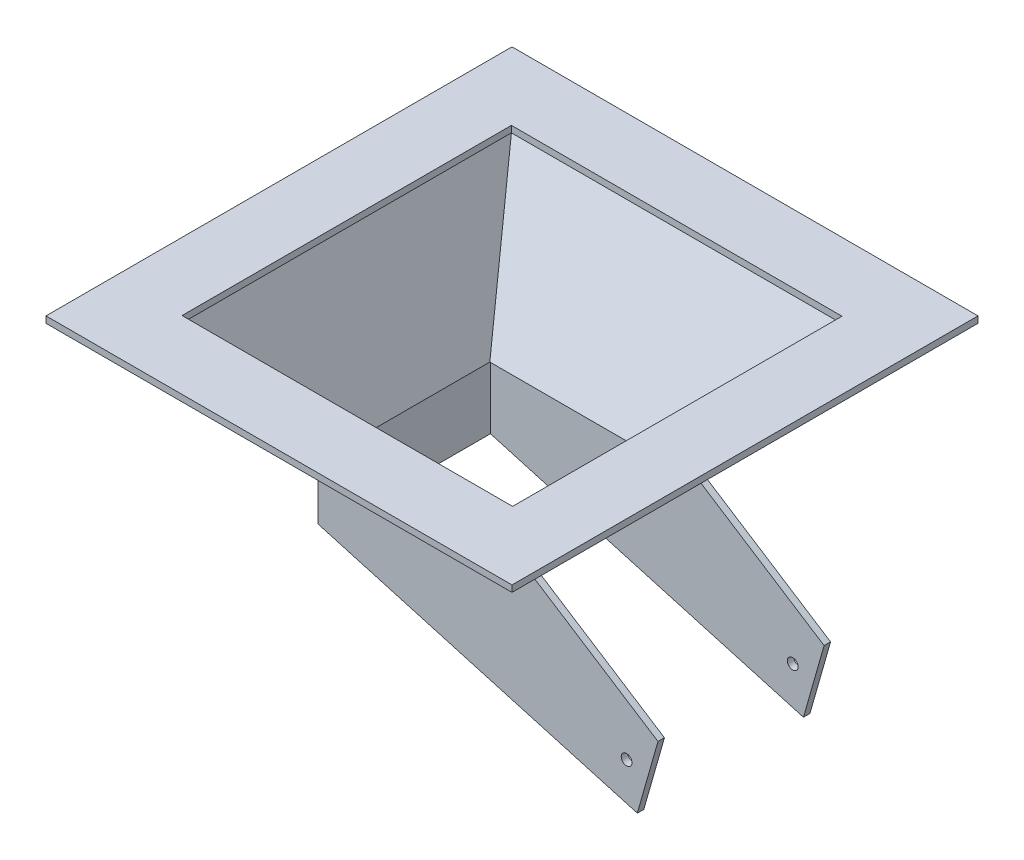
ISO-10303-21;
HEADER;
FILE_DESCRIPTION(('STEP AP214'),'2;1');
FILE_NAME('part.step','',(''),(''),'','','');
FILE_SCHEMA(('AUTOMOTIVE_DESIGN { 1 0 10303 214 1 1 1 1 }'));
ENDSEC;
DATA;
#1=APPLICATION_CONTEXT('core data for automotive mechanical design processes');
#2=APPLICATION_PROTOCOL_DEFINITION('international standard','automotive_design',2000,#1);
#3=PRODUCT_CONTEXT('',#1,'mechanical');
#4=PRODUCT('Part','Part','',(#3));
#5=PRODUCT_RELATED_PRODUCT_CATEGORY('part','',(#4));
#6=PRODUCT_DEFINITION_FORMATION('','',#4);
#7=PRODUCT_DEFINITION_CONTEXT('part definition',#1,'design');
#8=PRODUCT_DEFINITION('design','',#6,#7);
#9=PRODUCT_DEFINITION_SHAPE('','',#8);
#10=(LENGTH_UNIT() NAMED_UNIT(*) SI_UNIT(.MILLI.,.METRE.));
#11=(NAMED_UNIT(*) PLANE_ANGLE_UNIT() SI_UNIT($,.RADIAN.));
#12=(NAMED_UNIT(*) SI_UNIT($,.STERADIAN.) SOLID_ANGLE_UNIT());
#13=UNCERTAINTY_MEASURE_WITH_UNIT(LENGTH_MEASURE(1.E-05),#10,'distance_accuracy_value','');
#14=(GEOMETRIC_REPRESENTATION_CONTEXT(3) GLOBAL_UNCERTAINTY_ASSIGNED_CONTEXT((#13)) GLOBAL_UNIT_ASSIGNED_CONTEXT((#10,
#11,#12)) REPRESENTATION_CONTEXT('',''));
#15=CARTESIAN_POINT('',(0.,0.,0.));
#16=DIRECTION('',(0.,0.,1.));
#17=DIRECTION('',(1.,0.,0.));
#18=AXIS2_PLACEMENT_3D('',#15,#16,#17);
#19=CARTESIAN_POINT('',(0.,0.,0.));
#20=DIRECTION('',(0.,-1.,0.));
#21=DIRECTION('',(0.,0.,-1.));
#22=AXIS2_PLACEMENT_3D('',#19,#20,#21);
#23=PLANE('',#22);
#24=DIRECTION('',(1.,0.,0.));
#25=VECTOR('',#24,1.);
#26=CARTESIAN_POINT('',(0.,0.,36.335012556094));
#27=LINE('',#26,#25);
#28=CARTESIAN_POINT('',(-46.6098562283815,0.,36.335012556094));
#29=VERTEX_POINT('',#28);
#30=CARTESIAN_POINT('',(46.6098562283815,0.,36.335012556094));
#31=VERTEX_POINT('',#30);
#32=EDGE_CURVE('E569',#29,#31,#27,.T.);
#33=ORIENTED_EDGE('',*,*,#32,.T.);
#34=DIRECTION('',(0.,0.,-1.));
#35=VECTOR('',#34,1.);
#36=CARTESIAN_POINT('',(46.6098562283815,0.,0.));
#37=LINE('',#36,#35);
#38=CARTESIAN_POINT('',(46.6098562283815,0.,-36.335012556094));
#39=VERTEX_POINT('',#38);
#40=EDGE_CURVE('E572',#31,#39,#37,.T.);
#41=ORIENTED_EDGE('',*,*,#40,.T.);
#42=DIRECTION('',(-1.,0.,0.));
#43=VECTOR('',#42,1.);
#44=CARTESIAN_POINT('',(0.,0.,-36.335012556094));
#45=LINE('',#44,#43);
#46=CARTESIAN_POINT('',(-46.6098562283815,0.,-36.335012556094));
#47=VERTEX_POINT('',#46);
#48=EDGE_CURVE('E579',#39,#47,#45,.T.);
#49=ORIENTED_EDGE('',*,*,#48,.T.);
#50=DIRECTION('',(0.,0.,1.));
#51=VECTOR('',#50,1.);
#52=CARTESIAN_POINT('',(-46.6098562283815,0.,0.));
#53=LINE('',#52,#51);
#54=EDGE_CURVE('E574',#47,#29,#53,.T.);
#55=ORIENTED_EDGE('',*,*,#54,.T.);
#56=EDGE_LOOP('',(#33,#41,#49,#55));
#57=FACE_BOUND('',#56,.T.);
#58=DIRECTION('',(-1.,0.,0.));
#59=VECTOR('',#58,1.);
#60=CARTESIAN_POINT('',(-50.,0.,37.));
#61=LINE('',#60,#59);
#62=CARTESIAN_POINT('',(50.,0.,37.));
#63=VERTEX_POINT('',#62);
#64=CARTESIAN_POINT('',(-47.,0.,37.));
#65=VERTEX_POINT('',#64);
#66=EDGE_CURVE('E222',#63,#65,#61,.T.);
#67=ORIENTED_EDGE('',*,*,#66,.T.);
#68=DIRECTION('',(0.,0.,-1.));
#69=VECTOR('',#68,1.);
#70=CARTESIAN_POINT('',(-47.,0.,40.));
#71=LINE('',#70,#69);
#72=CARTESIAN_POINT('',(-47.,0.,-37.));
#73=VERTEX_POINT('',#72);
#74=EDGE_CURVE('E221',#65,#73,#71,.T.);
#75=ORIENTED_EDGE('',*,*,#74,.T.);
#76=DIRECTION('',(-1.,0.,0.));
#77=VECTOR('',#76,1.);
#78=CARTESIAN_POINT('',(-50.,0.,-37.));
#79=LINE('',#78,#77);
#80=CARTESIAN_POINT('',(50.,0.,-37.));
#81=VERTEX_POINT('',#80);
#82=EDGE_CURVE('E208',#81,#73,#79,.T.);
#83=ORIENTED_EDGE('',*,*,#82,.F.);
#84=DIRECTION('',(0.,0.,-1.));
#85=VECTOR('',#84,1.);
#86=CARTESIAN_POINT('',(50.,0.,40.));
#87=LINE('',#86,#85);
#88=EDGE_CURVE('E439',#63,#81,#87,.T.);
#89=ORIENTED_EDGE('',*,*,#88,.F.);
#90=EDGE_LOOP('',(#67,#75,#83,#89));
#91=FACE_BOUND('',#90,.T.);
#92=ADVANCED_FACE('F49',(#57,#91),#23,.T.);
#93=CARTESIAN_POINT('',(0.,0.,37.));
#94=DIRECTION('',(0.,0.,-1.));
#95=DIRECTION('',(-1.,0.,0.));
#96=AXIS2_PLACEMENT_3D('',#93,#94,#95);
#97=PLANE('',#96);
#98=CARTESIAN_POINT('',(93.1244971886201,-51.5905321351691,37.));
#99=DIRECTION('',(0.,0.,-1.));
#100=DIRECTION('',(-1.,0.,0.));
#101=AXIS2_PLACEMENT_3D('',#98,#99,#100);
#102=CIRCLE('',#101,2.5);
#103=CARTESIAN_POINT('',(90.6244971886201,-51.5905321351691,37.));
#104=VERTEX_POINT('',#103);
#105=EDGE_CURVE('E225',#104,#104,#102,.T.);
#106=ORIENTED_EDGE('',*,*,#105,.F.);
#107=EDGE_LOOP('',(#106));
#108=FACE_BOUND('',#107,.T.);
#109=DIRECTION('',(0.961884621768214,-0.273455616884751,0.));
#110=VECTOR('',#109,1.);
#111=CARTESIAN_POINT('',(98.094598,-70.577127,37.));
#112=LINE('',#111,#110);
#113=CARTESIAN_POINT('',(-47.,-29.327966856658,37.));
#114=VERTEX_POINT('',#113);
#115=CARTESIAN_POINT('',(98.094598,-70.577127,37.));
#116=VERTEX_POINT('',#115);
#117=EDGE_CURVE('E69',#114,#116,#112,.T.);
#118=ORIENTED_EDGE('',*,*,#117,.F.);
#119=DIRECTION('',(0.,1.,0.));
#120=VECTOR('',#119,1.);
#121=CARTESIAN_POINT('',(-47.,0.,37.));
#122=LINE('',#121,#120);
#123=EDGE_CURVE('E73',#114,#65,#122,.T.);
#124=ORIENTED_EDGE('',*,*,#123,.T.);
#125=ORIENTED_EDGE('',*,*,#66,.F.);
#126=DIRECTION('',(-0.841573516080053,0.540142589537853,0.));
#127=VECTOR('',#126,1.);
#128=CARTESIAN_POINT('',(50.,0.,37.));
#129=LINE('',#128,#127);
#130=CARTESIAN_POINT('',(107.665544,-37.011165,37.));
#131=VERTEX_POINT('',#130);
#132=EDGE_CURVE('E260',#131,#63,#129,.T.);
#133=ORIENTED_EDGE('',*,*,#132,.F.);
#134=DIRECTION('',(0.274209108479293,0.961670091469518,0.));
#135=VECTOR('',#134,1.);
#136=CARTESIAN_POINT('',(107.665544,-37.011165,37.));
#137=LINE('',#136,#135);
#138=EDGE_CURVE('E258',#116,#131,#137,.T.);
#139=ORIENTED_EDGE('',*,*,#138,.F.);
#140=EDGE_LOOP('',(#118,#124,#125,#133,#139));
#141=FACE_BOUND('',#140,.T.);
#142=ADVANCED_FACE('F303',(#108,#141),#97,.T.);
#143=CARTESIAN_POINT('',(0.,0.,-37.));
#144=DIRECTION('',(0.,0.,-1.));
#145=DIRECTION('',(-1.,0.,0.));
#146=AXIS2_PLACEMENT_3D('',#143,#144,#145);
#147=PLANE('',#146);
#148=CARTESIAN_POINT('',(93.1244971886201,-51.5905321351691,-37.));
#149=DIRECTION('',(0.,0.,-1.));
#150=DIRECTION('',(-1.,0.,0.));
#151=AXIS2_PLACEMENT_3D('',#148,#149,#150);
#152=CIRCLE('',#151,2.5);
#153=CARTESIAN_POINT('',(90.6244971886201,-51.5905321351691,-37.));
#154=VERTEX_POINT('',#153);
#155=EDGE_CURVE('E975',#154,#154,#152,.T.);
#156=ORIENTED_EDGE('',*,*,#155,.T.);
#157=EDGE_LOOP('',(#156));
#158=FACE_BOUND('',#157,.T.);
#159=DIRECTION('',(0.,1.,0.));
#160=VECTOR('',#159,1.);
#161=CARTESIAN_POINT('',(-47.,0.,-37.));
#162=LINE('',#161,#160);
#163=CARTESIAN_POINT('',(-47.,-29.327966856658,-37.));
#164=VERTEX_POINT('',#163);
#165=EDGE_CURVE('E12',#164,#73,#162,.T.);
#166=ORIENTED_EDGE('',*,*,#165,.F.);
#167=DIRECTION('',(0.961884621768214,-0.273455616884751,0.));
#168=VECTOR('',#167,1.);
#169=CARTESIAN_POINT('',(98.094598,-70.577127,-37.));
#170=LINE('',#169,#168);
#171=CARTESIAN_POINT('',(98.094598,-70.577127,-37.));
#172=VERTEX_POINT('',#171);
#173=EDGE_CURVE('E232',#164,#172,#170,.T.);
#174=ORIENTED_EDGE('',*,*,#173,.T.);
#175=DIRECTION('',(0.274209108479293,0.961670091469518,0.));
#176=VECTOR('',#175,1.);
#177=CARTESIAN_POINT('',(107.665544,-37.011165,-37.));
#178=LINE('',#177,#176);
#179=CARTESIAN_POINT('',(107.665544,-37.011165,-37.));
#180=VERTEX_POINT('',#179);
#181=EDGE_CURVE('E243',#172,#180,#178,.T.);
#182=ORIENTED_EDGE('',*,*,#181,.T.);
#183=DIRECTION('',(-0.841573516080053,0.540142589537853,0.));
#184=VECTOR('',#183,1.);
#185=CARTESIAN_POINT('',(50.,0.,-37.));
#186=LINE('',#185,#184);
#187=EDGE_CURVE('E214',#180,#81,#186,.T.);
#188=ORIENTED_EDGE('',*,*,#187,.T.);
#189=ORIENTED_EDGE('',*,*,#82,.T.);
#190=EDGE_LOOP('',(#166,#174,#182,#188,#189));
#191=FACE_BOUND('',#190,.T.);
#192=ADVANCED_FACE('F210',(#158,#191),#147,.F.);
#193=CARTESIAN_POINT('',(-39.1540130151844,-20.6073752711497,0.));
#194=DIRECTION('',(-0.884918222381982,-0.465746432832622,0.));
#195=DIRECTION('',(0.465746432832622,-0.884918222381982,0.));
#196=AXIS2_PLACEMENT_3D('',#193,#194,#195);
#197=PLANE('',#196);
#198=DIRECTION('',(-0.395662690984882,0.751759112871275,0.527550254646509));
#199=VECTOR('',#198,1.);
#200=CARTESIAN_POINT('',(-50.,0.,40.));
#201=LINE('',#200,#199);
#202=CARTESIAN_POINT('',(-50.,0.,40.));
#203=VERTEX_POINT('',#202);
#204=CARTESIAN_POINT('',(-80.,57.,80.));
#205=VERTEX_POINT('',#204);
#206=EDGE_CURVE('E370',#203,#205,#201,.T.);
#207=ORIENTED_EDGE('',*,*,#206,.T.);
#208=DIRECTION('',(0.,0.,1.));
#209=VECTOR('',#208,1.);
#210=CARTESIAN_POINT('',(-80.,57.,80.));
#211=LINE('',#210,#209);
#212=CARTESIAN_POINT('',(-80.,57.,-80.));
#213=VERTEX_POINT('',#212);
#214=EDGE_CURVE('E365',#213,#205,#211,.T.);
#215=ORIENTED_EDGE('',*,*,#214,.F.);
#216=DIRECTION('',(-0.395662690984882,0.751759112871275,-0.527550254646509));
#217=VECTOR('',#216,1.);
#218=CARTESIAN_POINT('',(-50.,0.,-40.));
#219=LINE('',#218,#217);
#220=CARTESIAN_POINT('',(-50.,0.,-40.));
#221=VERTEX_POINT('',#220);
#222=EDGE_CURVE('E362',#221,#213,#219,.T.);
#223=ORIENTED_EDGE('',*,*,#222,.F.);
#224=DIRECTION('',(0.,0.,1.));
#225=VECTOR('',#224,1.);
#226=CARTESIAN_POINT('',(-50.,0.,40.));
#227=LINE('',#226,#225);
#228=CARTESIAN_POINT('',(-50.,0.,-37.));
#229=VERTEX_POINT('',#228);
#230=EDGE_CURVE('E343',#221,#229,#227,.T.);
#231=ORIENTED_EDGE('',*,*,#230,.T.);
#232=CARTESIAN_POINT('',(-50.,0.,37.));
#233=VERTEX_POINT('',#232);
#234=EDGE_CURVE('E347',#229,#233,#227,.T.);
#235=ORIENTED_EDGE('',*,*,#234,.T.);
#236=DIRECTION('',(0.,0.,-1.));
#237=VECTOR('',#236,1.);
#238=CARTESIAN_POINT('',(-50.,0.,40.));
#239=LINE('',#238,#237);
#240=EDGE_CURVE('E275',#203,#233,#239,.T.);
#241=ORIENTED_EDGE('',*,*,#240,.F.);
#242=EDGE_LOOP('',(#207,#215,#223,#231,#235,#241));
#243=FACE_BOUND('',#242,.T.);
#244=ADVANCED_FACE('F363',(#243),#197,.T.);
#245=CARTESIAN_POINT('',(0.,-18.8080016498247,-26.8014023510002));
#246=DIRECTION('',(0.,0.57442574909643,0.818556692462413));
#247=DIRECTION('',(0.,-0.818556692462413,0.57442574909643));
#248=AXIS2_PLACEMENT_3D('',#245,#246,#247);
#249=PLANE('',#248);
#250=ORIENTED_EDGE('',*,*,#222,.T.);
#251=DIRECTION('',(-1.,0.,0.));
#252=VECTOR('',#251,1.);
#253=CARTESIAN_POINT('',(-80.,57.,-80.));
#254=LINE('',#253,#252);
#255=CARTESIAN_POINT('',(80.,57.,-80.));
#256=VERTEX_POINT('',#255);
#257=EDGE_CURVE('E459',#256,#213,#254,.T.);
#258=ORIENTED_EDGE('',*,*,#257,.F.);
#259=DIRECTION('',(0.395662690984881,0.751759112871275,-0.527550254646509));
#260=VECTOR('',#259,1.);
#261=CARTESIAN_POINT('',(50.,0.,-40.));
#262=LINE('',#261,#260);
#263=CARTESIAN_POINT('',(50.,0.,-40.));
#264=VERTEX_POINT('',#263);
#265=EDGE_CURVE('E373',#264,#256,#262,.T.);
#266=ORIENTED_EDGE('',*,*,#265,.F.);
#267=DIRECTION('',(-1.,0.,0.));
#268=VECTOR('',#267,1.);
#269=CARTESIAN_POINT('',(-50.,0.,-40.));
#270=LINE('',#269,#268);
#271=EDGE_CURVE('E356',#264,#221,#270,.T.);
#272=ORIENTED_EDGE('',*,*,#271,.T.);
#273=EDGE_LOOP('',(#250,#258,#266,#272));
#274=FACE_BOUND('',#273,.T.);
#275=ADVANCED_FACE('F400',(#274),#249,.F.);
#276=CARTESIAN_POINT('',(0.,-18.8080016498247,26.8014023510002));
#277=DIRECTION('',(0.,0.57442574909643,-0.818556692462413));
#278=DIRECTION('',(0.,0.818556692462413,0.57442574909643));
#279=AXIS2_PLACEMENT_3D('',#276,#277,#278);
#280=PLANE('',#279);
#281=DIRECTION('',(0.395662690984881,0.751759112871275,0.527550254646509));
#282=VECTOR('',#281,1.);
#283=CARTESIAN_POINT('',(50.,0.,40.));
#284=LINE('',#283,#282);
#285=CARTESIAN_POINT('',(50.,0.,40.));
#286=VERTEX_POINT('',#285);
#287=CARTESIAN_POINT('',(80.,57.,80.));
#288=VERTEX_POINT('',#287);
#289=EDGE_CURVE('E369',#286,#288,#284,.T.);
#290=ORIENTED_EDGE('',*,*,#289,.T.);
#291=DIRECTION('',(1.,0.,0.));
#292=VECTOR('',#291,1.);
#293=CARTESIAN_POINT('',(-80.,57.,80.));
#294=LINE('',#293,#292);
#295=EDGE_CURVE('E61',#205,#288,#294,.T.);
#296=ORIENTED_EDGE('',*,*,#295,.F.);
#297=ORIENTED_EDGE('',*,*,#206,.F.);
#298=DIRECTION('',(1.,0.,0.));
#299=VECTOR('',#298,1.);
#300=CARTESIAN_POINT('',(-50.,0.,40.));
#301=LINE('',#300,#299);
#302=EDGE_CURVE('E281',#203,#286,#301,.T.);
#303=ORIENTED_EDGE('',*,*,#302,.T.);
#304=EDGE_LOOP('',(#290,#296,#297,#303));
#305=FACE_BOUND('',#304,.T.);
#306=ADVANCED_FACE('F447',(#305),#280,.F.);
#307=CARTESIAN_POINT('',(39.1540130151844,-20.6073752711497,0.));
#308=DIRECTION('',(0.884918222381983,-0.465746432832622,0.));
#309=DIRECTION('',(0.465746432832622,0.884918222381983,0.));
#310=AXIS2_PLACEMENT_3D('',#307,#308,#309);
#311=PLANE('',#310);
#312=ORIENTED_EDGE('',*,*,#265,.T.);
#313=DIRECTION('',(0.,0.,-1.));
#314=VECTOR('',#313,1.);
#315=CARTESIAN_POINT('',(80.,57.,80.));
#316=LINE('',#315,#314);
#317=EDGE_CURVE('E454',#288,#256,#316,.T.);
#318=ORIENTED_EDGE('',*,*,#317,.F.);
#319=ORIENTED_EDGE('',*,*,#289,.F.);
#320=EDGE_CURVE('E948',#286,#63,#87,.T.);
#321=ORIENTED_EDGE('',*,*,#320,.T.);
#322=ORIENTED_EDGE('',*,*,#88,.T.);
#323=DIRECTION('',(0.,0.,1.));
#324=VECTOR('',#323,1.);
#325=CARTESIAN_POINT('',(50.,0.,-40.));
#326=LINE('',#325,#324);
#327=EDGE_CURVE('E247',#264,#81,#326,.T.);
#328=ORIENTED_EDGE('',*,*,#327,.F.);
#329=EDGE_LOOP('',(#312,#318,#319,#321,#322,#328));
#330=FACE_BOUND('',#329,.T.);
#331=ADVANCED_FACE('F51',(#330),#311,.T.);
#332=CARTESIAN_POINT('',(-36.4992583480384,-19.2101359726518,0.));
#333=DIRECTION('',(-0.884918222381982,-0.465746432832622,0.));
#334=DIRECTION('',(0.465746432832622,-0.884918222381982,0.));
#335=AXIS2_PLACEMENT_3D('',#332,#333,#334);
#336=PLANE('',#335);
#337=DIRECTION('',(-0.395662690984882,0.751759112871275,0.527550254646509));
#338=VECTOR('',#337,1.);
#339=CARTESIAN_POINT('',(-31.72885332825,-28.2739055102499,16.4936753559186));
#340=LINE('',#339,#338);
#341=CARTESIAN_POINT('',(-76.6098562283815,57.,76.335012556094));
#342=VERTEX_POINT('',#341);
#343=EDGE_CURVE('E469',#29,#342,#340,.T.);
#344=ORIENTED_EDGE('',*,*,#343,.F.);
#345=ORIENTED_EDGE('',*,*,#54,.F.);
#346=DIRECTION('',(-0.395662690984882,0.751759112871275,-0.527550254646509));
#347=VECTOR('',#346,1.);
#348=CARTESIAN_POINT('',(-31.72885332825,-28.2739055102499,-16.4936753559186));
#349=LINE('',#348,#347);
#350=CARTESIAN_POINT('',(-76.6098562283815,57.,-76.335012556094));
#351=VERTEX_POINT('',#350);
#352=EDGE_CURVE('E578',#47,#351,#349,.T.);
#353=ORIENTED_EDGE('',*,*,#352,.T.);
#354=DIRECTION('',(0.,0.,1.));
#355=VECTOR('',#354,1.);
#356=CARTESIAN_POINT('',(-76.6098562283815,57.,0.));
#357=LINE('',#356,#355);
#358=EDGE_CURVE('E589',#351,#342,#357,.T.);
#359=ORIENTED_EDGE('',*,*,#358,.T.);
#360=EDGE_LOOP('',(#344,#345,#353,#359));
#361=FACE_BOUND('',#360,.T.);
#362=ADVANCED_FACE('F560',(#361),#336,.F.);
#363=CARTESIAN_POINT('',(0.,-17.0847244025354,-24.345732273613));
#364=DIRECTION('',(0.,0.57442574909643,0.818556692462413));
#365=DIRECTION('',(0.,-0.818556692462413,0.57442574909643));
#366=AXIS2_PLACEMENT_3D('',#363,#364,#365);
#367=PLANE('',#366);
#368=ORIENTED_EDGE('',*,*,#352,.F.);
#369=ORIENTED_EDGE('',*,*,#48,.F.);
#370=DIRECTION('',(0.395662690984881,0.751759112871275,-0.527550254646509));
#371=VECTOR('',#370,1.);
#372=CARTESIAN_POINT('',(31.72885332825,-28.2739055102499,-16.4936753559186));
#373=LINE('',#372,#371);
#374=CARTESIAN_POINT('',(76.6098562283815,57.,-76.335012556094));
#375=VERTEX_POINT('',#374);
#376=EDGE_CURVE('E597',#39,#375,#373,.T.);
#377=ORIENTED_EDGE('',*,*,#376,.T.);
#378=DIRECTION('',(-1.,0.,0.));
#379=VECTOR('',#378,1.);
#380=CARTESIAN_POINT('',(0.,57.,-76.335012556094));
#381=LINE('',#380,#379);
#382=EDGE_CURVE('E585',#375,#351,#381,.T.);
#383=ORIENTED_EDGE('',*,*,#382,.T.);
#384=EDGE_LOOP('',(#368,#369,#377,#383));
#385=FACE_BOUND('',#384,.T.);
#386=ADVANCED_FACE('F605',(#385),#367,.T.);
#387=CARTESIAN_POINT('',(0.,-17.0847244025354,24.345732273613));
#388=DIRECTION('',(0.,0.57442574909643,-0.818556692462413));
#389=DIRECTION('',(0.,0.818556692462413,0.57442574909643));
#390=AXIS2_PLACEMENT_3D('',#387,#388,#389);
#391=PLANE('',#390);
#392=DIRECTION('',(0.395662690984881,0.751759112871275,0.527550254646509));
#393=VECTOR('',#392,1.);
#394=CARTESIAN_POINT('',(31.72885332825,-28.2739055102499,16.4936753559186));
#395=LINE('',#394,#393);
#396=CARTESIAN_POINT('',(76.6098562283815,57.,76.335012556094));
#397=VERTEX_POINT('',#396);
#398=EDGE_CURVE('E598',#31,#397,#395,.T.);
#399=ORIENTED_EDGE('',*,*,#398,.F.);
#400=ORIENTED_EDGE('',*,*,#32,.F.);
#401=ORIENTED_EDGE('',*,*,#343,.T.);
#402=DIRECTION('',(1.,0.,0.));
#403=VECTOR('',#402,1.);
#404=CARTESIAN_POINT('',(0.,57.,76.335012556094));
#405=LINE('',#404,#403);
#406=EDGE_CURVE('E592',#342,#397,#405,.T.);
#407=ORIENTED_EDGE('',*,*,#406,.T.);
#408=EDGE_LOOP('',(#399,#400,#401,#407));
#409=FACE_BOUND('',#408,.T.);
#410=ADVANCED_FACE('F693',(#409),#391,.T.);
#411=CARTESIAN_POINT('',(36.4992583480385,-19.2101359726518,0.));
#412=DIRECTION('',(0.884918222381983,-0.465746432832622,0.));
#413=DIRECTION('',(0.465746432832622,0.884918222381983,0.));
#414=AXIS2_PLACEMENT_3D('',#411,#412,#413);
#415=PLANE('',#414);
#416=ORIENTED_EDGE('',*,*,#376,.F.);
#417=ORIENTED_EDGE('',*,*,#40,.F.);
#418=ORIENTED_EDGE('',*,*,#398,.T.);
#419=DIRECTION('',(0.,0.,-1.));
#420=VECTOR('',#419,1.);
#421=CARTESIAN_POINT('',(76.6098562283815,57.,0.));
#422=LINE('',#421,#420);
#423=EDGE_CURVE('E588',#397,#375,#422,.T.);
#424=ORIENTED_EDGE('',*,*,#423,.T.);
#425=EDGE_LOOP('',(#416,#417,#418,#424));
#426=FACE_BOUND('',#425,.T.);
#427=ADVANCED_FACE('F677',(#426),#415,.F.);
#428=CARTESIAN_POINT('',(0.,60.,0.));
#429=DIRECTION('',(0.,-1.,0.));
#430=DIRECTION('',(0.,0.,-1.));
#431=AXIS2_PLACEMENT_3D('',#428,#429,#430);
#432=PLANE('',#431);
#433=DIRECTION('',(0.,0.,1.));
#434=VECTOR('',#433,1.);
#435=CARTESIAN_POINT('',(-108.,60.,108.));
#436=LINE('',#435,#434);
#437=CARTESIAN_POINT('',(-108.,60.,-108.));
#438=VERTEX_POINT('',#437);
#439=CARTESIAN_POINT('',(-108.,60.,108.));
#440=VERTEX_POINT('',#439);
#441=EDGE_CURVE('E631',#438,#440,#436,.T.);
#442=ORIENTED_EDGE('',*,*,#441,.T.);
#443=DIRECTION('',(1.,0.,0.));
#444=VECTOR('',#443,1.);
#445=CARTESIAN_POINT('',(-108.,60.,108.));
#446=LINE('',#445,#444);
#447=CARTESIAN_POINT('',(108.,60.,108.));
#448=VERTEX_POINT('',#447);
#449=EDGE_CURVE('E634',#440,#448,#446,.T.);
#450=ORIENTED_EDGE('',*,*,#449,.T.);
#451=DIRECTION('',(0.,0.,-1.));
#452=VECTOR('',#451,1.);
#453=CARTESIAN_POINT('',(108.,60.,108.));
#454=LINE('',#453,#452);
#455=CARTESIAN_POINT('',(108.,60.,-108.));
#456=VERTEX_POINT('',#455);
#457=EDGE_CURVE('E637',#448,#456,#454,.T.);
#458=ORIENTED_EDGE('',*,*,#457,.T.);
#459=DIRECTION('',(-1.,0.,0.));
#460=VECTOR('',#459,1.);
#461=CARTESIAN_POINT('',(-108.,60.,-108.));
#462=LINE('',#461,#460);
#463=EDGE_CURVE('E639',#456,#438,#462,.T.);
#464=ORIENTED_EDGE('',*,*,#463,.T.);
#465=EDGE_LOOP('',(#442,#450,#458,#464));
#466=FACE_BOUND('',#465,.T.);
#467=DIRECTION('',(0.,0.,1.));
#468=VECTOR('',#467,1.);
#469=CARTESIAN_POINT('',(-76.6098562283815,60.,-76.335012556094));
#470=LINE('',#469,#468);
#471=CARTESIAN_POINT('',(-76.6098562283815,60.,-76.335012556094));
#472=VERTEX_POINT('',#471);
#473=CARTESIAN_POINT('',(-76.6098562283815,60.,76.335012556094));
#474=VERTEX_POINT('',#473);
#475=EDGE_CURVE('E679',#472,#474,#470,.T.);
#476=ORIENTED_EDGE('',*,*,#475,.F.);
#477=DIRECTION('',(-1.,0.,0.));
#478=VECTOR('',#477,1.);
#479=CARTESIAN_POINT('',(76.6098562283815,60.,-76.335012556094));
#480=LINE('',#479,#478);
#481=CARTESIAN_POINT('',(76.6098562283815,60.,-76.335012556094));
#482=VERTEX_POINT('',#481);
#483=EDGE_CURVE('E615',#482,#472,#480,.T.);
#484=ORIENTED_EDGE('',*,*,#483,.F.);
#485=DIRECTION('',(0.,0.,-1.));
#486=VECTOR('',#485,1.);
#487=CARTESIAN_POINT('',(76.6098562283815,60.,76.335012556094));
#488=LINE('',#487,#486);
#489=CARTESIAN_POINT('',(76.6098562283815,60.,76.335012556094));
#490=VERTEX_POINT('',#489);
#491=EDGE_CURVE('E621',#490,#482,#488,.T.);
#492=ORIENTED_EDGE('',*,*,#491,.F.);
#493=DIRECTION('',(1.,0.,0.));
#494=VECTOR('',#493,1.);
#495=CARTESIAN_POINT('',(-76.6098562283815,60.,76.335012556094));
#496=LINE('',#495,#494);
#497=EDGE_CURVE('E681',#474,#490,#496,.T.);
#498=ORIENTED_EDGE('',*,*,#497,.F.);
#499=EDGE_LOOP('',(#476,#484,#492,#498));
#500=FACE_BOUND('',#499,.T.);
#501=ADVANCED_FACE('F481',(#466,#500),#432,.F.);
#502=CARTESIAN_POINT('',(0.,57.,0.));
#503=DIRECTION('',(0.,-1.,0.));
#504=DIRECTION('',(0.,0.,-1.));
#505=AXIS2_PLACEMENT_3D('',#502,#503,#504);
#506=PLANE('',#505);
#507=ORIENTED_EDGE('',*,*,#257,.T.);
#508=ORIENTED_EDGE('',*,*,#214,.T.);
#509=ORIENTED_EDGE('',*,*,#295,.T.);
#510=ORIENTED_EDGE('',*,*,#317,.T.);
#511=EDGE_LOOP('',(#507,#508,#509,#510));
#512=FACE_BOUND('',#511,.T.);
#513=DIRECTION('',(0.,0.,1.));
#514=VECTOR('',#513,1.);
#515=CARTESIAN_POINT('',(-108.,57.,108.));
#516=LINE('',#515,#514);
#517=CARTESIAN_POINT('',(-108.,57.,-108.));
#518=VERTEX_POINT('',#517);
#519=CARTESIAN_POINT('',(-108.,57.,108.));
#520=VERTEX_POINT('',#519);
#521=EDGE_CURVE('E630',#518,#520,#516,.T.);
#522=ORIENTED_EDGE('',*,*,#521,.F.);
#523=DIRECTION('',(-1.,0.,0.));
#524=VECTOR('',#523,1.);
#525=CARTESIAN_POINT('',(-108.,57.,-108.));
#526=LINE('',#525,#524);
#527=CARTESIAN_POINT('',(108.,57.,-108.));
#528=VERTEX_POINT('',#527);
#529=EDGE_CURVE('E635',#528,#518,#526,.T.);
#530=ORIENTED_EDGE('',*,*,#529,.F.);
#531=DIRECTION('',(0.,0.,-1.));
#532=VECTOR('',#531,1.);
#533=CARTESIAN_POINT('',(108.,57.,108.));
#534=LINE('',#533,#532);
#535=CARTESIAN_POINT('',(108.,57.,108.));
#536=VERTEX_POINT('',#535);
#537=EDGE_CURVE('E646',#536,#528,#534,.T.);
#538=ORIENTED_EDGE('',*,*,#537,.F.);
#539=DIRECTION('',(1.,0.,0.));
#540=VECTOR('',#539,1.);
#541=CARTESIAN_POINT('',(-108.,57.,108.));
#542=LINE('',#541,#540);
#543=EDGE_CURVE('E644',#520,#536,#542,.T.);
#544=ORIENTED_EDGE('',*,*,#543,.F.);
#545=EDGE_LOOP('',(#522,#530,#538,#544));
#546=FACE_BOUND('',#545,.T.);
#547=ADVANCED_FACE('F457',(#512,#546),#506,.T.);
#548=CARTESIAN_POINT('',(-108.,60.,108.));
#549=DIRECTION('',(1.,0.,0.));
#550=DIRECTION('',(0.,0.,-1.));
#551=AXIS2_PLACEMENT_3D('',#548,#549,#550);
#552=PLANE('',#551);
#553=ORIENTED_EDGE('',*,*,#521,.T.);
#554=DIRECTION('',(0.,-1.,0.));
#555=VECTOR('',#554,1.);
#556=CARTESIAN_POINT('',(-108.,60.,108.));
#557=LINE('',#556,#555);
#558=EDGE_CURVE('E583',#440,#520,#557,.T.);
#559=ORIENTED_EDGE('',*,*,#558,.F.);
#560=ORIENTED_EDGE('',*,*,#441,.F.);
#561=DIRECTION('',(0.,-1.,0.));
#562=VECTOR('',#561,1.);
#563=CARTESIAN_POINT('',(-108.,60.,-108.));
#564=LINE('',#563,#562);
#565=EDGE_CURVE('E641',#438,#518,#564,.T.);
#566=ORIENTED_EDGE('',*,*,#565,.T.);
#567=EDGE_LOOP('',(#553,#559,#560,#566));
#568=FACE_BOUND('',#567,.T.);
#569=ADVANCED_FACE('F480',(#568),#552,.F.);
#570=CARTESIAN_POINT('',(-108.,60.,108.));
#571=DIRECTION('',(0.,0.,-1.));
#572=DIRECTION('',(-1.,0.,0.));
#573=AXIS2_PLACEMENT_3D('',#570,#571,#572);
#574=PLANE('',#573);
#575=ORIENTED_EDGE('',*,*,#543,.T.);
#576=DIRECTION('',(0.,-1.,0.));
#577=VECTOR('',#576,1.);
#578=CARTESIAN_POINT('',(108.,60.,108.));
#579=LINE('',#578,#577);
#580=EDGE_CURVE('E654',#448,#536,#579,.T.);
#581=ORIENTED_EDGE('',*,*,#580,.F.);
#582=ORIENTED_EDGE('',*,*,#449,.F.);
#583=ORIENTED_EDGE('',*,*,#558,.T.);
#584=EDGE_LOOP('',(#575,#581,#582,#583));
#585=FACE_BOUND('',#584,.T.);
#586=ADVANCED_FACE('F660',(#585),#574,.F.);
#587=CARTESIAN_POINT('',(108.,60.,108.));
#588=DIRECTION('',(-1.,0.,0.));
#589=DIRECTION('',(0.,0.,1.));
#590=AXIS2_PLACEMENT_3D('',#587,#588,#589);
#591=PLANE('',#590);
#592=ORIENTED_EDGE('',*,*,#537,.T.);
#593=DIRECTION('',(0.,-1.,0.));
#594=VECTOR('',#593,1.);
#595=CARTESIAN_POINT('',(108.,60.,-108.));
#596=LINE('',#595,#594);
#597=EDGE_CURVE('E651',#456,#528,#596,.T.);
#598=ORIENTED_EDGE('',*,*,#597,.F.);
#599=ORIENTED_EDGE('',*,*,#457,.F.);
#600=ORIENTED_EDGE('',*,*,#580,.T.);
#601=EDGE_LOOP('',(#592,#598,#599,#600));
#602=FACE_BOUND('',#601,.T.);
#603=ADVANCED_FACE('F670',(#602),#591,.F.);
#604=CARTESIAN_POINT('',(-108.,60.,-108.));
#605=DIRECTION('',(0.,0.,1.));
#606=DIRECTION('',(1.,0.,0.));
#607=AXIS2_PLACEMENT_3D('',#604,#605,#606);
#608=PLANE('',#607);
#609=ORIENTED_EDGE('',*,*,#529,.T.);
#610=ORIENTED_EDGE('',*,*,#565,.F.);
#611=ORIENTED_EDGE('',*,*,#463,.F.);
#612=ORIENTED_EDGE('',*,*,#597,.T.);
#613=EDGE_LOOP('',(#609,#610,#611,#612));
#614=FACE_BOUND('',#613,.T.);
#615=ADVANCED_FACE('F483',(#614),#608,.F.);
#616=CARTESIAN_POINT('',(-76.6098562283815,60.,-76.335012556094));
#617=DIRECTION('',(1.,0.,0.));
#618=DIRECTION('',(0.,0.,-1.));
#619=AXIS2_PLACEMENT_3D('',#616,#617,#618);
#620=PLANE('',#619);
#621=ORIENTED_EDGE('',*,*,#358,.F.);
#622=DIRECTION('',(0.,-1.,0.));
#623=VECTOR('',#622,1.);
#624=CARTESIAN_POINT('',(-76.6098562283815,60.,-76.335012556094));
#625=LINE('',#624,#623);
#626=EDGE_CURVE('E613',#472,#351,#625,.T.);
#627=ORIENTED_EDGE('',*,*,#626,.F.);
#628=ORIENTED_EDGE('',*,*,#475,.T.);
#629=DIRECTION('',(0.,-1.,0.));
#630=VECTOR('',#629,1.);
#631=CARTESIAN_POINT('',(-76.6098562283815,60.,76.335012556094));
#632=LINE('',#631,#630);
#633=EDGE_CURVE('E627',#474,#342,#632,.T.);
#634=ORIENTED_EDGE('',*,*,#633,.T.);
#635=EDGE_LOOP('',(#621,#627,#628,#634));
#636=FACE_BOUND('',#635,.T.);
#637=ADVANCED_FACE('F712',(#636),#620,.T.);
#638=CARTESIAN_POINT('',(-76.6098562283815,60.,76.335012556094));
#639=DIRECTION('',(0.,0.,-1.));
#640=DIRECTION('',(-1.,0.,0.));
#641=AXIS2_PLACEMENT_3D('',#638,#639,#640);
#642=PLANE('',#641);
#643=ORIENTED_EDGE('',*,*,#406,.F.);
#644=ORIENTED_EDGE('',*,*,#633,.F.);
#645=ORIENTED_EDGE('',*,*,#497,.T.);
#646=DIRECTION('',(0.,-1.,0.));
#647=VECTOR('',#646,1.);
#648=CARTESIAN_POINT('',(76.6098562283815,60.,76.335012556094));
#649=LINE('',#648,#647);
#650=EDGE_CURVE('E619',#490,#397,#649,.T.);
#651=ORIENTED_EDGE('',*,*,#650,.T.);
#652=EDGE_LOOP('',(#643,#644,#645,#651));
#653=FACE_BOUND('',#652,.T.);
#654=ADVANCED_FACE('F692',(#653),#642,.T.);
#655=CARTESIAN_POINT('',(76.6098562283815,60.,76.335012556094));
#656=DIRECTION('',(-1.,0.,0.));
#657=DIRECTION('',(0.,0.,1.));
#658=AXIS2_PLACEMENT_3D('',#655,#656,#657);
#659=PLANE('',#658);
#660=ORIENTED_EDGE('',*,*,#423,.F.);
#661=ORIENTED_EDGE('',*,*,#650,.F.);
#662=ORIENTED_EDGE('',*,*,#491,.T.);
#663=DIRECTION('',(0.,-1.,0.));
#664=VECTOR('',#663,1.);
#665=CARTESIAN_POINT('',(76.6098562283815,60.,-76.335012556094));
#666=LINE('',#665,#664);
#667=EDGE_CURVE('E610',#482,#375,#666,.T.);
#668=ORIENTED_EDGE('',*,*,#667,.T.);
#669=EDGE_LOOP('',(#660,#661,#662,#668));
#670=FACE_BOUND('',#669,.T.);
#671=ADVANCED_FACE('F690',(#670),#659,.T.);
#672=CARTESIAN_POINT('',(76.6098562283815,60.,-76.335012556094));
#673=DIRECTION('',(0.,0.,1.));
#674=DIRECTION('',(1.,0.,0.));
#675=AXIS2_PLACEMENT_3D('',#672,#673,#674);
#676=PLANE('',#675);
#677=ORIENTED_EDGE('',*,*,#382,.F.);
#678=ORIENTED_EDGE('',*,*,#667,.F.);
#679=ORIENTED_EDGE('',*,*,#483,.T.);
#680=ORIENTED_EDGE('',*,*,#626,.T.);
#681=EDGE_LOOP('',(#677,#678,#679,#680));
#682=FACE_BOUND('',#681,.T.);
#683=ADVANCED_FACE('F320',(#682),#676,.T.);
#684=CARTESIAN_POINT('',(-50.,-28.4750923724541,40.));
#685=DIRECTION('',(1.,0.,0.));
#686=DIRECTION('',(0.,0.,-1.));
#687=AXIS2_PLACEMENT_3D('',#684,#685,#686);
#688=PLANE('',#687);
#689=ORIENTED_EDGE('',*,*,#240,.T.);
#690=ORIENTED_EDGE('',*,*,#234,.F.);
#691=ORIENTED_EDGE('',*,*,#230,.F.);
#692=DIRECTION('',(0.,-1.,0.));
#693=VECTOR('',#692,1.);
#694=CARTESIAN_POINT('',(-50.,-28.4750923724541,-40.));
#695=LINE('',#694,#693);
#696=CARTESIAN_POINT('',(-50.,-28.4750923724541,-40.));
#697=VERTEX_POINT('',#696);
#698=EDGE_CURVE('E218',#221,#697,#695,.T.);
#699=ORIENTED_EDGE('',*,*,#698,.T.);
#700=DIRECTION('',(0.,0.,-1.));
#701=VECTOR('',#700,1.);
#702=CARTESIAN_POINT('',(-50.,-28.4750923724541,40.));
#703=LINE('',#702,#701);
#704=CARTESIAN_POINT('',(-50.,-28.4750923724541,40.));
#705=VERTEX_POINT('',#704);
#706=EDGE_CURVE('E683',#705,#697,#703,.T.);
#707=ORIENTED_EDGE('',*,*,#706,.F.);
#708=DIRECTION('',(0.,-1.,0.));
#709=VECTOR('',#708,1.);
#710=CARTESIAN_POINT('',(-50.,-28.4750923724541,40.));
#711=LINE('',#710,#709);
#712=EDGE_CURVE('E254',#203,#705,#711,.T.);
#713=ORIENTED_EDGE('',*,*,#712,.F.);
#714=EDGE_LOOP('',(#689,#690,#691,#699,#707,#713));
#715=FACE_BOUND('',#714,.T.);
#716=ADVANCED_FACE('F316',(#715),#688,.F.);
#717=CARTESIAN_POINT('',(98.094598,-70.577127,40.));
#718=DIRECTION('',(0.273455616884751,0.961884621768214,0.));
#719=DIRECTION('',(-0.961884621768214,0.273455616884751,0.));
#720=AXIS2_PLACEMENT_3D('',#717,#718,#719);
#721=PLANE('',#720);
#722=ORIENTED_EDGE('',*,*,#706,.T.);
#723=DIRECTION('',(0.961884621768214,-0.273455616884751,0.));
#724=VECTOR('',#723,1.);
#725=CARTESIAN_POINT('',(98.094598,-70.577127,-40.));
#726=LINE('',#725,#724);
#727=CARTESIAN_POINT('',(98.094598,-70.577127,-40.));
#728=VERTEX_POINT('',#727);
#729=EDGE_CURVE('E236',#697,#728,#726,.T.);
#730=ORIENTED_EDGE('',*,*,#729,.T.);
#731=DIRECTION('',(0.,0.,1.));
#732=VECTOR('',#731,1.);
#733=CARTESIAN_POINT('',(98.094598,-70.577127,-40.));
#734=LINE('',#733,#732);
#735=EDGE_CURVE('E248',#728,#172,#734,.T.);
#736=ORIENTED_EDGE('',*,*,#735,.T.);
#737=ORIENTED_EDGE('',*,*,#173,.F.);
#738=DIRECTION('',(0.,0.,-1.));
#739=VECTOR('',#738,1.);
#740=CARTESIAN_POINT('',(-47.,-29.3279673724541,40.));
#741=LINE('',#740,#739);
#742=EDGE_CURVE('E224',#114,#164,#741,.T.);
#743=ORIENTED_EDGE('',*,*,#742,.F.);
#744=ORIENTED_EDGE('',*,*,#117,.T.);
#745=DIRECTION('',(0.,0.,-1.));
#746=VECTOR('',#745,1.);
#747=CARTESIAN_POINT('',(98.094598,-70.577127,40.));
#748=LINE('',#747,#746);
#749=CARTESIAN_POINT('',(98.094598,-70.577127,40.));
#750=VERTEX_POINT('',#749);
#751=EDGE_CURVE('E686',#750,#116,#748,.T.);
#752=ORIENTED_EDGE('',*,*,#751,.F.);
#753=DIRECTION('',(0.961884621768214,-0.273455616884751,0.));
#754=VECTOR('',#753,1.);
#755=CARTESIAN_POINT('',(98.094598,-70.577127,40.));
#756=LINE('',#755,#754);
#757=EDGE_CURVE('E251',#705,#750,#756,.T.);
#758=ORIENTED_EDGE('',*,*,#757,.F.);
#759=EDGE_LOOP('',(#722,#730,#736,#737,#743,#744,#752,#758));
#760=FACE_BOUND('',#759,.T.);
#761=ADVANCED_FACE('F313',(#760),#721,.F.);
#762=CARTESIAN_POINT('',(107.665544,-37.011165,40.));
#763=DIRECTION('',(-0.961670091469518,0.274209108479293,0.));
#764=DIRECTION('',(-0.274209108479293,-0.961670091469518,0.));
#765=AXIS2_PLACEMENT_3D('',#762,#763,#764);
#766=PLANE('',#765);
#767=ORIENTED_EDGE('',*,*,#138,.T.);
#768=DIRECTION('',(0.,0.,-1.));
#769=VECTOR('',#768,1.);
#770=CARTESIAN_POINT('',(107.665544,-37.011165,40.));
#771=LINE('',#770,#769);
#772=CARTESIAN_POINT('',(107.665544,-37.011165,40.));
#773=VERTEX_POINT('',#772);
#774=EDGE_CURVE('E263',#773,#131,#771,.T.);
#775=ORIENTED_EDGE('',*,*,#774,.F.);
#776=DIRECTION('',(0.274209108479293,0.961670091469518,0.));
#777=VECTOR('',#776,1.);
#778=CARTESIAN_POINT('',(107.665544,-37.011165,40.));
#779=LINE('',#778,#777);
#780=EDGE_CURVE('E253',#750,#773,#779,.T.);
#781=ORIENTED_EDGE('',*,*,#780,.F.);
#782=ORIENTED_EDGE('',*,*,#751,.T.);
#783=EDGE_LOOP('',(#767,#775,#781,#782));
#784=FACE_BOUND('',#783,.T.);
#785=ADVANCED_FACE('F309',(#784),#766,.F.);
#786=CARTESIAN_POINT('',(50.,0.,40.));
#787=DIRECTION('',(-0.540142589537853,-0.841573516080053,0.));
#788=DIRECTION('',(0.841573516080053,-0.540142589537853,0.));
#789=AXIS2_PLACEMENT_3D('',#786,#787,#788);
#790=PLANE('',#789);
#791=ORIENTED_EDGE('',*,*,#132,.T.);
#792=ORIENTED_EDGE('',*,*,#320,.F.);
#793=DIRECTION('',(-0.841573516080053,0.540142589537853,0.));
#794=VECTOR('',#793,1.);
#795=CARTESIAN_POINT('',(50.,0.,40.));
#796=LINE('',#795,#794);
#797=EDGE_CURVE('E256',#773,#286,#796,.T.);
#798=ORIENTED_EDGE('',*,*,#797,.F.);
#799=ORIENTED_EDGE('',*,*,#774,.T.);
#800=EDGE_LOOP('',(#791,#792,#798,#799));
#801=FACE_BOUND('',#800,.T.);
#802=ADVANCED_FACE('F299',(#801),#790,.F.);
#803=CARTESIAN_POINT('',(0.,0.,40.));
#804=DIRECTION('',(0.,0.,-1.));
#805=DIRECTION('',(-1.,0.,0.));
#806=AXIS2_PLACEMENT_3D('',#803,#804,#805);
#807=PLANE('',#806);
#808=CARTESIAN_POINT('',(93.1244971886201,-51.5905321351691,40.));
#809=DIRECTION('',(0.,0.,1.));
#810=DIRECTION('',(1.,0.,0.));
#811=AXIS2_PLACEMENT_3D('',#808,#809,#810);
#812=CIRCLE('',#811,2.5);
#813=CARTESIAN_POINT('',(95.6244971886201,-51.5905321351691,40.));
#814=VERTEX_POINT('',#813);
#815=EDGE_CURVE('E971',#814,#814,#812,.T.);
#816=ORIENTED_EDGE('',*,*,#815,.F.);
#817=EDGE_LOOP('',(#816));
#818=FACE_BOUND('',#817,.T.);
#819=ORIENTED_EDGE('',*,*,#757,.T.);
#820=ORIENTED_EDGE('',*,*,#780,.T.);
#821=ORIENTED_EDGE('',*,*,#797,.T.);
#822=ORIENTED_EDGE('',*,*,#302,.F.);
#823=ORIENTED_EDGE('',*,*,#712,.T.);
#824=EDGE_LOOP('',(#819,#820,#821,#822,#823));
#825=FACE_BOUND('',#824,.T.);
#826=ADVANCED_FACE('F288',(#818,#825),#807,.F.);
#827=CARTESIAN_POINT('',(50.,0.,-40.));
#828=DIRECTION('',(0.540142589537853,0.841573516080053,0.));
#829=DIRECTION('',(-0.841573516080053,0.540142589537853,0.));
#830=AXIS2_PLACEMENT_3D('',#827,#828,#829);
#831=PLANE('',#830);
#832=ORIENTED_EDGE('',*,*,#187,.F.);
#833=DIRECTION('',(0.,0.,1.));
#834=VECTOR('',#833,1.);
#835=CARTESIAN_POINT('',(107.665544,-37.011165,-40.));
#836=LINE('',#835,#834);
#837=CARTESIAN_POINT('',(107.665544,-37.011165,-40.));
#838=VERTEX_POINT('',#837);
#839=EDGE_CURVE('E245',#838,#180,#836,.T.);
#840=ORIENTED_EDGE('',*,*,#839,.F.);
#841=DIRECTION('',(-0.841573516080053,0.540142589537853,0.));
#842=VECTOR('',#841,1.);
#843=CARTESIAN_POINT('',(50.,0.,-40.));
#844=LINE('',#843,#842);
#845=EDGE_CURVE('E241',#838,#264,#844,.T.);
#846=ORIENTED_EDGE('',*,*,#845,.T.);
#847=ORIENTED_EDGE('',*,*,#327,.T.);
#848=EDGE_LOOP('',(#832,#840,#846,#847));
#849=FACE_BOUND('',#848,.T.);
#850=ADVANCED_FACE('F298',(#849),#831,.T.);
#851=CARTESIAN_POINT('',(107.665544,-37.011165,-40.));
#852=DIRECTION('',(0.961670091469518,-0.274209108479293,0.));
#853=DIRECTION('',(0.274209108479293,0.961670091469518,0.));
#854=AXIS2_PLACEMENT_3D('',#851,#852,#853);
#855=PLANE('',#854);
#856=ORIENTED_EDGE('',*,*,#181,.F.);
#857=ORIENTED_EDGE('',*,*,#735,.F.);
#858=DIRECTION('',(0.274209108479293,0.961670091469518,0.));
#859=VECTOR('',#858,1.);
#860=CARTESIAN_POINT('',(107.665544,-37.011165,-40.));
#861=LINE('',#860,#859);
#862=EDGE_CURVE('E238',#728,#838,#861,.T.);
#863=ORIENTED_EDGE('',*,*,#862,.T.);
#864=ORIENTED_EDGE('',*,*,#839,.T.);
#865=EDGE_LOOP('',(#856,#857,#863,#864));
#866=FACE_BOUND('',#865,.T.);
#867=ADVANCED_FACE('F301',(#866),#855,.T.);
#868=CARTESIAN_POINT('',(0.,0.,-40.));
#869=DIRECTION('',(0.,0.,-1.));
#870=DIRECTION('',(-1.,0.,0.));
#871=AXIS2_PLACEMENT_3D('',#868,#869,#870);
#872=PLANE('',#871);
#873=CARTESIAN_POINT('',(93.1244971886201,-51.5905321351691,-40.));
#874=DIRECTION('',(0.,0.,1.));
#875=DIRECTION('',(1.,0.,0.));
#876=AXIS2_PLACEMENT_3D('',#873,#874,#875);
#877=CIRCLE('',#876,2.5);
#878=CARTESIAN_POINT('',(95.6244971886201,-51.5905321351691,-40.));
#879=VERTEX_POINT('',#878);
#880=EDGE_CURVE('E972',#879,#879,#877,.T.);
#881=ORIENTED_EDGE('',*,*,#880,.T.);
#882=EDGE_LOOP('',(#881));
#883=FACE_BOUND('',#882,.T.);
#884=ORIENTED_EDGE('',*,*,#698,.F.);
#885=ORIENTED_EDGE('',*,*,#271,.F.);
#886=ORIENTED_EDGE('',*,*,#845,.F.);
#887=ORIENTED_EDGE('',*,*,#862,.F.);
#888=ORIENTED_EDGE('',*,*,#729,.F.);
#889=EDGE_LOOP('',(#884,#885,#886,#887,#888));
#890=FACE_BOUND('',#889,.T.);
#891=ADVANCED_FACE('F354',(#883,#890),#872,.T.);
#892=CARTESIAN_POINT('',(-47.,0.,40.));
#893=DIRECTION('',(-1.,0.,0.));
#894=DIRECTION('',(0.,0.,1.));
#895=AXIS2_PLACEMENT_3D('',#892,#893,#894);
#896=PLANE('',#895);
#897=ORIENTED_EDGE('',*,*,#123,.F.);
#898=ORIENTED_EDGE('',*,*,#742,.T.);
#899=ORIENTED_EDGE('',*,*,#165,.T.);
#900=ORIENTED_EDGE('',*,*,#74,.F.);
#901=EDGE_LOOP('',(#897,#898,#899,#900));
#902=FACE_BOUND('',#901,.T.);
#903=ADVANCED_FACE('F228',(#902),#896,.F.);
#904=CARTESIAN_POINT('',(93.1244971886201,-51.5905321351691,-40.));
#905=DIRECTION('',(0.,0.,1.));
#906=DIRECTION('',(1.,0.,0.));
#907=AXIS2_PLACEMENT_3D('',#904,#905,#906);
#908=CYLINDRICAL_SURFACE('',#907,2.5);
#909=ORIENTED_EDGE('',*,*,#880,.F.);
#910=EDGE_LOOP('',(#909));
#911=FACE_BOUND('',#910,.T.);
#912=ORIENTED_EDGE('',*,*,#155,.F.);
#913=EDGE_LOOP('',(#912));
#914=FACE_BOUND('',#913,.T.);
#915=ADVANCED_FACE('F813',(#911,#914),#908,.F.);
#916=ORIENTED_EDGE('',*,*,#105,.T.);
#917=EDGE_LOOP('',(#916));
#918=FACE_BOUND('',#917,.T.);
#919=ORIENTED_EDGE('',*,*,#815,.T.);
#920=EDGE_LOOP('',(#919));
#921=FACE_BOUND('',#920,.T.);
#922=ADVANCED_FACE('F920',(#918,#921),#908,.F.);
#923=CLOSED_SHELL('',(#92,#142,#192,#244,#275,#306,#331,#362,#386,#410,#427,#501,#547,#569,#586,
#603,#615,#637,#654,#671,#683,#716,#761,#785,#802,#826,#850,#867,#891,#903,#915,#922));
#924=MANIFOLD_SOLID_BREP('B2',#923);
#925=ADVANCED_BREP_SHAPE_REPRESENTATION('',(#18,#924),#14);
#926=SHAPE_DEFINITION_REPRESENTATION(#9,#925);
ENDSEC;
END-ISO-10303-21;
